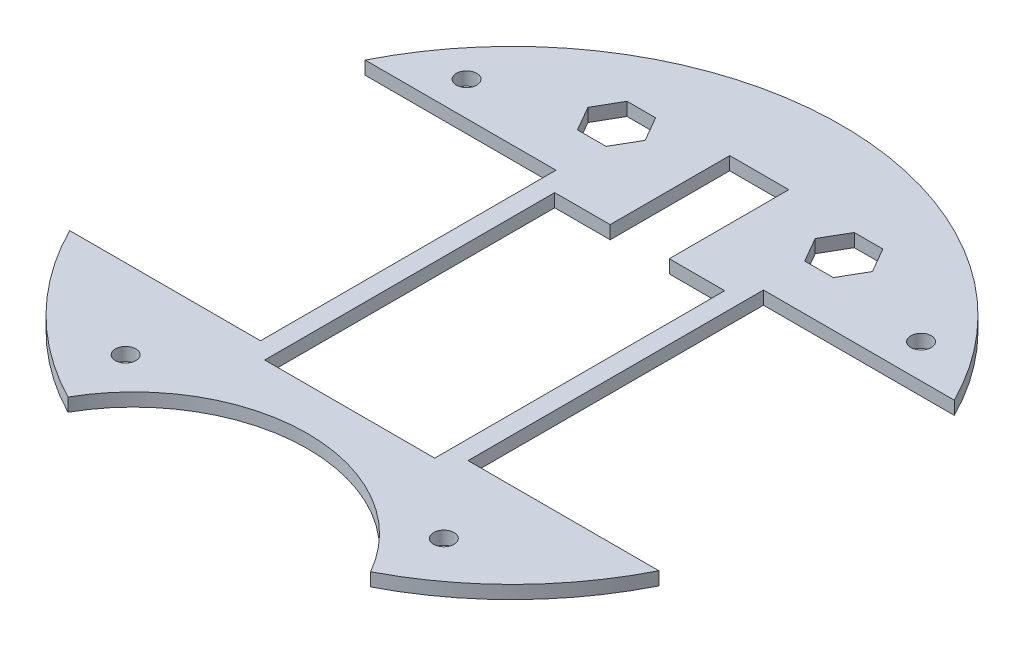
ISO-10303-21;
HEADER;
FILE_DESCRIPTION(('STEP AP214'),'2;1');
FILE_NAME('part.step','',(''),(''),'','','');
FILE_SCHEMA(('AUTOMOTIVE_DESIGN { 1 0 10303 214 1 1 1 1 }'));
ENDSEC;
DATA;
#1=APPLICATION_CONTEXT('core data for automotive mechanical design processes');
#2=APPLICATION_PROTOCOL_DEFINITION('international standard','automotive_design',2000,#1);
#3=PRODUCT_CONTEXT('',#1,'mechanical');
#4=PRODUCT('Part','Part','',(#3));
#5=PRODUCT_RELATED_PRODUCT_CATEGORY('part','',(#4));
#6=PRODUCT_DEFINITION_FORMATION('','',#4);
#7=PRODUCT_DEFINITION_CONTEXT('part definition',#1,'design');
#8=PRODUCT_DEFINITION('design','',#6,#7);
#9=PRODUCT_DEFINITION_SHAPE('','',#8);
#10=(LENGTH_UNIT() NAMED_UNIT(*) SI_UNIT(.MILLI.,.METRE.));
#11=(NAMED_UNIT(*) PLANE_ANGLE_UNIT() SI_UNIT($,.RADIAN.));
#12=(NAMED_UNIT(*) SI_UNIT($,.STERADIAN.) SOLID_ANGLE_UNIT());
#13=UNCERTAINTY_MEASURE_WITH_UNIT(LENGTH_MEASURE(1.E-05),#10,'distance_accuracy_value','');
#14=(GEOMETRIC_REPRESENTATION_CONTEXT(3) GLOBAL_UNCERTAINTY_ASSIGNED_CONTEXT((#13)) GLOBAL_UNIT_ASSIGNED_CONTEXT((#10,
#11,#12)) REPRESENTATION_CONTEXT('',''));
#15=CARTESIAN_POINT('',(0.,0.,0.));
#16=DIRECTION('',(0.,0.,1.));
#17=DIRECTION('',(1.,0.,0.));
#18=AXIS2_PLACEMENT_3D('',#15,#16,#17);
#19=CARTESIAN_POINT('',(18.7,0.,-28.1));
#20=DIRECTION('',(0.,0.,-1.));
#21=DIRECTION('',(-1.,0.,0.));
#22=AXIS2_PLACEMENT_3D('',#19,#20,#21);
#23=PLANE('',#22);
#24=DIRECTION('',(-1.,0.,0.));
#25=VECTOR('',#24,1.);
#26=CARTESIAN_POINT('',(18.7,0.,-28.1));
#27=LINE('',#26,#25);
#28=CARTESIAN_POINT('',(-6.5,0.,-28.1));
#29=VERTEX_POINT('',#28);
#30=CARTESIAN_POINT('',(-18.7,0.,-28.1));
#31=VERTEX_POINT('',#30);
#32=EDGE_CURVE('E424',#29,#31,#27,.T.);
#33=ORIENTED_EDGE('',*,*,#32,.F.);
#34=DIRECTION('',(0.,1.,0.));
#35=VECTOR('',#34,1.);
#36=CARTESIAN_POINT('',(-6.5,0.,-28.1));
#37=LINE('',#36,#35);
#38=CARTESIAN_POINT('',(-6.5,2.9,-28.1));
#39=VERTEX_POINT('',#38);
#40=EDGE_CURVE('E345',#29,#39,#37,.T.);
#41=ORIENTED_EDGE('',*,*,#40,.T.);
#42=DIRECTION('',(-1.,0.,0.));
#43=VECTOR('',#42,1.);
#44=CARTESIAN_POINT('',(18.7,2.9,-28.1));
#45=LINE('',#44,#43);
#46=CARTESIAN_POINT('',(-18.7,2.9,-28.1));
#47=VERTEX_POINT('',#46);
#48=EDGE_CURVE('E436',#39,#47,#45,.T.);
#49=ORIENTED_EDGE('',*,*,#48,.T.);
#50=DIRECTION('',(0.,1.,0.));
#51=VECTOR('',#50,1.);
#52=CARTESIAN_POINT('',(-18.7,0.,-28.1));
#53=LINE('',#52,#51);
#54=EDGE_CURVE('E439',#31,#47,#53,.T.);
#55=ORIENTED_EDGE('',*,*,#54,.F.);
#56=EDGE_LOOP('',(#33,#41,#49,#55));
#57=FACE_BOUND('',#56,.T.);
#58=ADVANCED_FACE('F33',(#57),#23,.F.);
#59=CARTESIAN_POINT('',(0.,2.9,0.));
#60=DIRECTION('',(0.,-1.,0.));
#61=DIRECTION('',(0.,0.,-1.));
#62=AXIS2_PLACEMENT_3D('',#59,#60,#61);
#63=CYLINDRICAL_SURFACE('',#62,72.5);
#64=CARTESIAN_POINT('',(0.,0.,0.));
#65=DIRECTION('',(0.,1.,0.));
#66=DIRECTION('',(0.,0.,1.));
#67=AXIS2_PLACEMENT_3D('',#64,#65,#66);
#68=CIRCLE('',#67,72.5);
#69=CARTESIAN_POINT('',(33.2911053697012,0.,64.4045984636458));
#70=VERTEX_POINT('',#69);
#71=CARTESIAN_POINT('',(64.8074069840786,0.,32.4999999999999));
#72=VERTEX_POINT('',#71);
#73=EDGE_CURVE('E453',#70,#72,#68,.T.);
#74=ORIENTED_EDGE('',*,*,#73,.T.);
#75=DIRECTION('',(0.,1.,0.));
#76=VECTOR('',#75,1.);
#77=CARTESIAN_POINT('',(64.8074069840786,0.,32.4999999999999));
#78=LINE('',#77,#76);
#79=CARTESIAN_POINT('',(64.8074069840786,2.9,32.4999999999999));
#80=VERTEX_POINT('',#79);
#81=EDGE_CURVE('E378',#72,#80,#78,.T.);
#82=ORIENTED_EDGE('',*,*,#81,.T.);
#83=CARTESIAN_POINT('',(0.,2.9,0.));
#84=DIRECTION('',(0.,1.,0.));
#85=DIRECTION('',(0.,0.,1.));
#86=AXIS2_PLACEMENT_3D('',#83,#84,#85);
#87=CIRCLE('',#86,72.5);
#88=CARTESIAN_POINT('',(33.2911053697012,2.9,64.4045984636458));
#89=VERTEX_POINT('',#88);
#90=EDGE_CURVE('E454',#89,#80,#87,.T.);
#91=ORIENTED_EDGE('',*,*,#90,.F.);
#92=DIRECTION('',(0.,-1.,0.));
#93=VECTOR('',#92,1.);
#94=CARTESIAN_POINT('',(33.2911053697012,2.9,64.4045984636458));
#95=LINE('',#94,#93);
#96=EDGE_CURVE('E11',#89,#70,#95,.T.);
#97=ORIENTED_EDGE('',*,*,#96,.T.);
#98=EDGE_LOOP('',(#74,#82,#91,#97));
#99=FACE_BOUND('',#98,.T.);
#100=ADVANCED_FACE('F475',(#99),#63,.T.);
#101=CARTESIAN_POINT('',(64.8074069840786,2.9,-32.5));
#102=VERTEX_POINT('',#101);
#103=CARTESIAN_POINT('',(-64.8074069840786,2.9,-32.5));
#104=VERTEX_POINT('',#103);
#105=EDGE_CURVE('E457',#102,#104,#87,.T.);
#106=ORIENTED_EDGE('',*,*,#105,.F.);
#107=DIRECTION('',(0.,1.,0.));
#108=VECTOR('',#107,1.);
#109=CARTESIAN_POINT('',(64.8074069840786,0.,-32.5));
#110=LINE('',#109,#108);
#111=CARTESIAN_POINT('',(64.8074069840786,0.,-32.5));
#112=VERTEX_POINT('',#111);
#113=EDGE_CURVE('E371',#112,#102,#110,.T.);
#114=ORIENTED_EDGE('',*,*,#113,.F.);
#115=CARTESIAN_POINT('',(-64.8074069840786,0.,-32.5));
#116=VERTEX_POINT('',#115);
#117=EDGE_CURVE('E462',#112,#116,#68,.T.);
#118=ORIENTED_EDGE('',*,*,#117,.T.);
#119=DIRECTION('',(0.,1.,0.));
#120=VECTOR('',#119,1.);
#121=CARTESIAN_POINT('',(-64.8074069840786,0.,-32.5));
#122=LINE('',#121,#120);
#123=EDGE_CURVE('E408',#116,#104,#122,.T.);
#124=ORIENTED_EDGE('',*,*,#123,.T.);
#125=EDGE_LOOP('',(#106,#114,#118,#124));
#126=FACE_BOUND('',#125,.T.);
#127=ADVANCED_FACE('F492',(#126),#63,.T.);
#128=CARTESIAN_POINT('',(0.,2.9,83.2397996376034));
#129=DIRECTION('',(0.,-1.,0.));
#130=DIRECTION('',(0.,0.,-1.));
#131=AXIS2_PLACEMENT_3D('',#128,#129,#130);
#132=CYLINDRICAL_SURFACE('',#131,38.25);
#133=CARTESIAN_POINT('',(0.,0.,83.2397996376034));
#134=DIRECTION('',(0.,-1.,0.));
#135=DIRECTION('',(0.,0.,1.));
#136=AXIS2_PLACEMENT_3D('',#133,#134,#135);
#137=CIRCLE('',#136,38.25);
#138=CARTESIAN_POINT('',(-33.2911053697012,0.,64.4045984636458));
#139=VERTEX_POINT('',#138);
#140=EDGE_CURVE('E442',#139,#70,#137,.T.);
#141=ORIENTED_EDGE('',*,*,#140,.T.);
#142=ORIENTED_EDGE('',*,*,#96,.F.);
#143=CARTESIAN_POINT('',(0.,2.9,83.2397996376034));
#144=DIRECTION('',(0.,-1.,0.));
#145=DIRECTION('',(0.,0.,1.));
#146=AXIS2_PLACEMENT_3D('',#143,#144,#145);
#147=CIRCLE('',#146,38.25);
#148=CARTESIAN_POINT('',(-33.2911053697012,2.9,64.4045984636458));
#149=VERTEX_POINT('',#148);
#150=EDGE_CURVE('E449',#149,#89,#147,.T.);
#151=ORIENTED_EDGE('',*,*,#150,.F.);
#152=DIRECTION('',(0.,-1.,0.));
#153=VECTOR('',#152,1.);
#154=CARTESIAN_POINT('',(-33.2911053697012,2.9,64.4045984636458));
#155=LINE('',#154,#153);
#156=EDGE_CURVE('E41',#149,#139,#155,.T.);
#157=ORIENTED_EDGE('',*,*,#156,.T.);
#158=EDGE_LOOP('',(#141,#142,#151,#157));
#159=FACE_BOUND('',#158,.T.);
#160=ADVANCED_FACE('F35',(#159),#132,.F.);
#161=CARTESIAN_POINT('',(-64.8074069840787,2.9,32.4999999999999));
#162=VERTEX_POINT('',#161);
#163=EDGE_CURVE('E452',#162,#149,#87,.T.);
#164=ORIENTED_EDGE('',*,*,#163,.F.);
#165=DIRECTION('',(0.,1.,0.));
#166=VECTOR('',#165,1.);
#167=CARTESIAN_POINT('',(-64.8074069840787,0.,32.4999999999999));
#168=LINE('',#167,#166);
#169=CARTESIAN_POINT('',(-64.8074069840787,0.,32.4999999999999));
#170=VERTEX_POINT('',#169);
#171=EDGE_CURVE('E405',#170,#162,#168,.T.);
#172=ORIENTED_EDGE('',*,*,#171,.F.);
#173=EDGE_CURVE('E460',#170,#139,#68,.T.);
#174=ORIENTED_EDGE('',*,*,#173,.T.);
#175=ORIENTED_EDGE('',*,*,#156,.F.);
#176=EDGE_LOOP('',(#164,#172,#174,#175));
#177=FACE_BOUND('',#176,.T.);
#178=ADVANCED_FACE('F494',(#177),#63,.T.);
#179=CARTESIAN_POINT('',(0.,2.9,41.6198998188017));
#180=DIRECTION('',(0.,1.,0.));
#181=DIRECTION('',(0.,0.,1.));
#182=AXIS2_PLACEMENT_3D('',#179,#180,#181);
#183=PLANE('',#182);
#184=CARTESIAN_POINT('',(-35.,2.9,50.));
#185=DIRECTION('',(0.,1.,0.));
#186=DIRECTION('',(0.,0.,1.));
#187=AXIS2_PLACEMENT_3D('',#184,#185,#186);
#188=CIRCLE('',#187,2.25);
#189=CARTESIAN_POINT('',(-35.,2.9,52.25));
#190=VERTEX_POINT('',#189);
#191=EDGE_CURVE('E782',#190,#190,#188,.T.);
#192=ORIENTED_EDGE('',*,*,#191,.F.);
#193=EDGE_LOOP('',(#192));
#194=FACE_BOUND('',#193,.T.);
#195=CARTESIAN_POINT('',(-50.,2.9,-40.));
#196=DIRECTION('',(0.,1.,0.));
#197=DIRECTION('',(0.,0.,1.));
#198=AXIS2_PLACEMENT_3D('',#195,#196,#197);
#199=CIRCLE('',#198,2.25);
#200=CARTESIAN_POINT('',(-50.,2.9,-37.75));
#201=VERTEX_POINT('',#200);
#202=EDGE_CURVE('E787',#201,#201,#199,.T.);
#203=ORIENTED_EDGE('',*,*,#202,.F.);
#204=EDGE_LOOP('',(#203));
#205=FACE_BOUND('',#204,.T.);
#206=CARTESIAN_POINT('',(50.,2.9,-40.));
#207=DIRECTION('',(0.,1.,0.));
#208=DIRECTION('',(0.,0.,1.));
#209=AXIS2_PLACEMENT_3D('',#206,#207,#208);
#210=CIRCLE('',#209,2.25);
#211=CARTESIAN_POINT('',(50.,2.9,-37.75));
#212=VERTEX_POINT('',#211);
#213=EDGE_CURVE('E795',#212,#212,#210,.T.);
#214=ORIENTED_EDGE('',*,*,#213,.F.);
#215=EDGE_LOOP('',(#214));
#216=FACE_BOUND('',#215,.T.);
#217=CARTESIAN_POINT('',(35.,2.9,50.));
#218=DIRECTION('',(0.,1.,0.));
#219=DIRECTION('',(0.,0.,1.));
#220=AXIS2_PLACEMENT_3D('',#217,#218,#219);
#221=CIRCLE('',#220,2.25);
#222=CARTESIAN_POINT('',(35.,2.9,52.25));
#223=VERTEX_POINT('',#222);
#224=EDGE_CURVE('E255',#223,#223,#221,.T.);
#225=ORIENTED_EDGE('',*,*,#224,.F.);
#226=EDGE_LOOP('',(#225));
#227=FACE_BOUND('',#226,.T.);
#228=DIRECTION('',(1.,0.,0.));
#229=VECTOR('',#228,1.);
#230=CARTESIAN_POINT('',(21.8534410329166,2.9,-42.55));
#231=LINE('',#230,#229);
#232=CARTESIAN_POINT('',(21.8534410329166,2.9,-42.55));
#233=VERTEX_POINT('',#232);
#234=CARTESIAN_POINT('',(28.1465589670834,2.9,-42.55));
#235=VERTEX_POINT('',#234);
#236=EDGE_CURVE('E48',#233,#235,#231,.T.);
#237=ORIENTED_EDGE('',*,*,#236,.F.);
#238=DIRECTION('',(0.5,0.,0.866025403784439));
#239=VECTOR('',#238,1.);
#240=CARTESIAN_POINT('',(18.7068820658331,2.9,-48.));
#241=LINE('',#240,#239);
#242=CARTESIAN_POINT('',(18.7068820658331,2.9,-48.));
#243=VERTEX_POINT('',#242);
#244=EDGE_CURVE('E249',#243,#233,#241,.T.);
#245=ORIENTED_EDGE('',*,*,#244,.F.);
#246=DIRECTION('',(-0.5,0.,0.866025403784438));
#247=VECTOR('',#246,1.);
#248=CARTESIAN_POINT('',(21.8534410329165,2.9,-53.45));
#249=LINE('',#248,#247);
#250=CARTESIAN_POINT('',(21.8534410329165,2.9,-53.45));
#251=VERTEX_POINT('',#250);
#252=EDGE_CURVE('E252',#251,#243,#249,.T.);
#253=ORIENTED_EDGE('',*,*,#252,.F.);
#254=DIRECTION('',(-1.,0.,0.));
#255=VECTOR('',#254,1.);
#256=CARTESIAN_POINT('',(28.1465589670835,2.9,-53.45));
#257=LINE('',#256,#255);
#258=CARTESIAN_POINT('',(28.1465589670835,2.9,-53.45));
#259=VERTEX_POINT('',#258);
#260=EDGE_CURVE('E272',#259,#251,#257,.T.);
#261=ORIENTED_EDGE('',*,*,#260,.F.);
#262=DIRECTION('',(-0.5,0.,-0.866025403784439));
#263=VECTOR('',#262,1.);
#264=CARTESIAN_POINT('',(31.2931179341669,2.9,-48.));
#265=LINE('',#264,#263);
#266=CARTESIAN_POINT('',(31.2931179341669,2.9,-48.));
#267=VERTEX_POINT('',#266);
#268=EDGE_CURVE('E269',#267,#259,#265,.T.);
#269=ORIENTED_EDGE('',*,*,#268,.F.);
#270=DIRECTION('',(0.499999999999999,0.,-0.866025403784439));
#271=VECTOR('',#270,1.);
#272=CARTESIAN_POINT('',(28.1465589670835,2.9,-42.55));
#273=LINE('',#272,#271);
#274=EDGE_CURVE('E266',#235,#267,#273,.T.);
#275=ORIENTED_EDGE('',*,*,#274,.F.);
#276=EDGE_LOOP('',(#237,#245,#253,#261,#269,#275));
#277=FACE_BOUND('',#276,.T.);
#278=DIRECTION('',(0.5,0.,-0.866025403784439));
#279=VECTOR('',#278,1.);
#280=CARTESIAN_POINT('',(-21.8534410329166,2.9,-42.55));
#281=LINE('',#280,#279);
#282=CARTESIAN_POINT('',(-21.8534410329166,2.9,-42.55));
#283=VERTEX_POINT('',#282);
#284=CARTESIAN_POINT('',(-18.7068820658331,2.9,-48.));
#285=VERTEX_POINT('',#284);
#286=EDGE_CURVE('E279',#283,#285,#281,.T.);
#287=ORIENTED_EDGE('',*,*,#286,.F.);
#288=DIRECTION('',(1.,0.,0.));
#289=VECTOR('',#288,1.);
#290=CARTESIAN_POINT('',(-28.1465589670835,2.9,-42.55));
#291=LINE('',#290,#289);
#292=CARTESIAN_POINT('',(-28.1465589670835,2.9,-42.55));
#293=VERTEX_POINT('',#292);
#294=EDGE_CURVE('E291',#293,#283,#291,.T.);
#295=ORIENTED_EDGE('',*,*,#294,.F.);
#296=DIRECTION('',(0.499999999999999,0.,0.866025403784439));
#297=VECTOR('',#296,1.);
#298=CARTESIAN_POINT('',(-31.2931179341669,2.9,-48.));
#299=LINE('',#298,#297);
#300=CARTESIAN_POINT('',(-31.2931179341669,2.9,-48.));
#301=VERTEX_POINT('',#300);
#302=EDGE_CURVE('E317',#301,#293,#299,.T.);
#303=ORIENTED_EDGE('',*,*,#302,.F.);
#304=DIRECTION('',(-0.5,0.,0.866025403784439));
#305=VECTOR('',#304,1.);
#306=CARTESIAN_POINT('',(-28.1465589670835,2.9,-53.45));
#307=LINE('',#306,#305);
#308=CARTESIAN_POINT('',(-28.1465589670835,2.9,-53.45));
#309=VERTEX_POINT('',#308);
#310=EDGE_CURVE('E314',#309,#301,#307,.T.);
#311=ORIENTED_EDGE('',*,*,#310,.F.);
#312=DIRECTION('',(-1.,0.,0.));
#313=VECTOR('',#312,1.);
#314=CARTESIAN_POINT('',(-21.8534410329165,2.9,-53.45));
#315=LINE('',#314,#313);
#316=CARTESIAN_POINT('',(-21.8534410329165,2.9,-53.45));
#317=VERTEX_POINT('',#316);
#318=EDGE_CURVE('E311',#317,#309,#315,.T.);
#319=ORIENTED_EDGE('',*,*,#318,.F.);
#320=DIRECTION('',(-0.5,0.,-0.866025403784438));
#321=VECTOR('',#320,1.);
#322=CARTESIAN_POINT('',(-18.7068820658331,2.9,-48.));
#323=LINE('',#322,#321);
#324=EDGE_CURVE('E308',#285,#317,#323,.T.);
#325=ORIENTED_EDGE('',*,*,#324,.F.);
#326=EDGE_LOOP('',(#287,#295,#303,#311,#319,#325));
#327=FACE_BOUND('',#326,.T.);
#328=DIRECTION('',(0.,0.,1.));
#329=VECTOR('',#328,1.);
#330=CARTESIAN_POINT('',(-6.5,2.9,-28.1));
#331=LINE('',#330,#329);
#332=CARTESIAN_POINT('',(-6.5,2.9,-54.4));
#333=VERTEX_POINT('',#332);
#334=EDGE_CURVE('E324',#333,#39,#331,.T.);
#335=ORIENTED_EDGE('',*,*,#334,.F.);
#336=DIRECTION('',(-1.,0.,0.));
#337=VECTOR('',#336,1.);
#338=CARTESIAN_POINT('',(6.5,2.9,-54.4));
#339=LINE('',#338,#337);
#340=CARTESIAN_POINT('',(6.5,2.9,-54.4));
#341=VERTEX_POINT('',#340);
#342=EDGE_CURVE('E339',#341,#333,#339,.T.);
#343=ORIENTED_EDGE('',*,*,#342,.F.);
#344=DIRECTION('',(0.,0.,-1.));
#345=VECTOR('',#344,1.);
#346=CARTESIAN_POINT('',(6.5,2.9,-28.1));
#347=LINE('',#346,#345);
#348=CARTESIAN_POINT('',(6.5,2.9,-28.1));
#349=VERTEX_POINT('',#348);
#350=EDGE_CURVE('E347',#349,#341,#347,.T.);
#351=ORIENTED_EDGE('',*,*,#350,.F.);
#352=CARTESIAN_POINT('',(18.7,2.9,-28.1));
#353=VERTEX_POINT('',#352);
#354=EDGE_CURVE('E418',#353,#349,#45,.T.);
#355=ORIENTED_EDGE('',*,*,#354,.F.);
#356=DIRECTION('',(0.,0.,-1.));
#357=VECTOR('',#356,1.);
#358=CARTESIAN_POINT('',(18.7,2.9,35.7));
#359=LINE('',#358,#357);
#360=CARTESIAN_POINT('',(18.7,2.9,35.7));
#361=VERTEX_POINT('',#360);
#362=EDGE_CURVE('E433',#361,#353,#359,.T.);
#363=ORIENTED_EDGE('',*,*,#362,.F.);
#364=DIRECTION('',(1.,0.,0.));
#365=VECTOR('',#364,1.);
#366=CARTESIAN_POINT('',(-18.7,2.9,35.7));
#367=LINE('',#366,#365);
#368=CARTESIAN_POINT('',(-18.7,2.9,35.7));
#369=VERTEX_POINT('',#368);
#370=EDGE_CURVE('E430',#369,#361,#367,.T.);
#371=ORIENTED_EDGE('',*,*,#370,.F.);
#372=DIRECTION('',(0.,0.,1.));
#373=VECTOR('',#372,1.);
#374=CARTESIAN_POINT('',(-18.7,2.9,-28.1));
#375=LINE('',#374,#373);
#376=EDGE_CURVE('E407',#47,#369,#375,.T.);
#377=ORIENTED_EDGE('',*,*,#376,.F.);
#378=ORIENTED_EDGE('',*,*,#48,.F.);
#379=EDGE_LOOP('',(#335,#343,#351,#355,#363,#371,#377,#378));
#380=FACE_BOUND('',#379,.T.);
#381=DIRECTION('',(1.,0.,0.));
#382=VECTOR('',#381,1.);
#383=CARTESIAN_POINT('',(34.6299999999999,2.9,32.5));
#384=LINE('',#383,#382);
#385=CARTESIAN_POINT('',(22.8299999999999,2.9,32.4999999999999));
#386=VERTEX_POINT('',#385);
#387=EDGE_CURVE('E365',#386,#80,#384,.T.);
#388=ORIENTED_EDGE('',*,*,#387,.F.);
#389=DIRECTION('',(0.,0.,1.));
#390=VECTOR('',#389,1.);
#391=CARTESIAN_POINT('',(22.8299999999999,2.9,-32.5));
#392=LINE('',#391,#390);
#393=CARTESIAN_POINT('',(22.8299999999999,2.9,-32.5));
#394=VERTEX_POINT('',#393);
#395=EDGE_CURVE('E374',#394,#386,#392,.T.);
#396=ORIENTED_EDGE('',*,*,#395,.F.);
#397=DIRECTION('',(-1.,0.,0.));
#398=VECTOR('',#397,1.);
#399=CARTESIAN_POINT('',(64.8074069840786,2.9,-32.5));
#400=LINE('',#399,#398);
#401=EDGE_CURVE('E354',#102,#394,#400,.T.);
#402=ORIENTED_EDGE('',*,*,#401,.F.);
#403=ORIENTED_EDGE('',*,*,#105,.T.);
#404=DIRECTION('',(-1.,0.,0.));
#405=VECTOR('',#404,1.);
#406=CARTESIAN_POINT('',(-22.8299999999999,2.9,-32.5));
#407=LINE('',#406,#405);
#408=CARTESIAN_POINT('',(-22.8299999999999,2.9,-32.5));
#409=VERTEX_POINT('',#408);
#410=EDGE_CURVE('E391',#409,#104,#407,.T.);
#411=ORIENTED_EDGE('',*,*,#410,.F.);
#412=DIRECTION('',(0.,0.,-1.));
#413=VECTOR('',#412,1.);
#414=CARTESIAN_POINT('',(-22.8299999999999,2.9,32.4999999999999));
#415=LINE('',#414,#413);
#416=CARTESIAN_POINT('',(-22.8299999999999,2.9,32.4999999999999));
#417=VERTEX_POINT('',#416);
#418=EDGE_CURVE('E400',#417,#409,#415,.T.);
#419=ORIENTED_EDGE('',*,*,#418,.F.);
#420=DIRECTION('',(1.,0.,0.));
#421=VECTOR('',#420,1.);
#422=CARTESIAN_POINT('',(-34.6299999999999,2.9,32.5));
#423=LINE('',#422,#421);
#424=EDGE_CURVE('E381',#162,#417,#423,.T.);
#425=ORIENTED_EDGE('',*,*,#424,.F.);
#426=ORIENTED_EDGE('',*,*,#163,.T.);
#427=ORIENTED_EDGE('',*,*,#150,.T.);
#428=ORIENTED_EDGE('',*,*,#90,.T.);
#429=EDGE_LOOP('',(#388,#396,#402,#403,#411,#419,#425,#426,#427,#428));
#430=FACE_BOUND('',#429,.T.);
#431=ADVANCED_FACE('F478',(#194,#205,#216,#227,#277,#327,#380,#430),#183,.T.);
#432=CARTESIAN_POINT('',(0.,0.,41.6198998188017));
#433=DIRECTION('',(0.,1.,0.));
#434=DIRECTION('',(0.,0.,1.));
#435=AXIS2_PLACEMENT_3D('',#432,#433,#434);
#436=PLANE('',#435);
#437=CARTESIAN_POINT('',(-35.,0.,50.));
#438=DIRECTION('',(0.,1.,0.));
#439=DIRECTION('',(0.,0.,1.));
#440=AXIS2_PLACEMENT_3D('',#437,#438,#439);
#441=CIRCLE('',#440,2.25);
#442=CARTESIAN_POINT('',(-35.,0.,52.25));
#443=VERTEX_POINT('',#442);
#444=EDGE_CURVE('E779',#443,#443,#441,.T.);
#445=ORIENTED_EDGE('',*,*,#444,.T.);
#446=EDGE_LOOP('',(#445));
#447=FACE_BOUND('',#446,.T.);
#448=CARTESIAN_POINT('',(-50.,0.,-40.));
#449=DIRECTION('',(0.,1.,0.));
#450=DIRECTION('',(0.,0.,1.));
#451=AXIS2_PLACEMENT_3D('',#448,#449,#450);
#452=CIRCLE('',#451,2.25);
#453=CARTESIAN_POINT('',(-50.,0.,-37.75));
#454=VERTEX_POINT('',#453);
#455=EDGE_CURVE('E783',#454,#454,#452,.T.);
#456=ORIENTED_EDGE('',*,*,#455,.T.);
#457=EDGE_LOOP('',(#456));
#458=FACE_BOUND('',#457,.T.);
#459=CARTESIAN_POINT('',(50.,0.,-40.));
#460=DIRECTION('',(0.,1.,0.));
#461=DIRECTION('',(0.,0.,1.));
#462=AXIS2_PLACEMENT_3D('',#459,#460,#461);
#463=CIRCLE('',#462,2.25);
#464=CARTESIAN_POINT('',(50.,0.,-37.75));
#465=VERTEX_POINT('',#464);
#466=EDGE_CURVE('E792',#465,#465,#463,.T.);
#467=ORIENTED_EDGE('',*,*,#466,.T.);
#468=EDGE_LOOP('',(#467));
#469=FACE_BOUND('',#468,.T.);
#470=CARTESIAN_POINT('',(35.,0.,50.));
#471=DIRECTION('',(0.,1.,0.));
#472=DIRECTION('',(0.,0.,1.));
#473=AXIS2_PLACEMENT_3D('',#470,#471,#472);
#474=CIRCLE('',#473,2.25);
#475=CARTESIAN_POINT('',(35.,0.,52.25));
#476=VERTEX_POINT('',#475);
#477=EDGE_CURVE('E267',#476,#476,#474,.T.);
#478=ORIENTED_EDGE('',*,*,#477,.T.);
#479=EDGE_LOOP('',(#478));
#480=FACE_BOUND('',#479,.T.);
#481=DIRECTION('',(0.5,0.,0.866025403784439));
#482=VECTOR('',#481,1.);
#483=CARTESIAN_POINT('',(18.7068820658331,0.,-48.));
#484=LINE('',#483,#482);
#485=CARTESIAN_POINT('',(18.7068820658331,0.,-48.));
#486=VERTEX_POINT('',#485);
#487=CARTESIAN_POINT('',(21.8534410329166,0.,-42.55));
#488=VERTEX_POINT('',#487);
#489=EDGE_CURVE('E238',#486,#488,#484,.T.);
#490=ORIENTED_EDGE('',*,*,#489,.T.);
#491=DIRECTION('',(1.,0.,0.));
#492=VECTOR('',#491,1.);
#493=CARTESIAN_POINT('',(21.8534410329166,0.,-42.55));
#494=LINE('',#493,#492);
#495=CARTESIAN_POINT('',(28.1465589670835,0.,-42.55));
#496=VERTEX_POINT('',#495);
#497=EDGE_CURVE('E232',#488,#496,#494,.T.);
#498=ORIENTED_EDGE('',*,*,#497,.T.);
#499=DIRECTION('',(0.499999999999999,0.,-0.866025403784439));
#500=VECTOR('',#499,1.);
#501=CARTESIAN_POINT('',(28.1465589670835,0.,-42.55));
#502=LINE('',#501,#500);
#503=CARTESIAN_POINT('',(31.2931179341669,0.,-48.));
#504=VERTEX_POINT('',#503);
#505=EDGE_CURVE('E241',#496,#504,#502,.T.);
#506=ORIENTED_EDGE('',*,*,#505,.T.);
#507=DIRECTION('',(-0.5,0.,-0.866025403784439));
#508=VECTOR('',#507,1.);
#509=CARTESIAN_POINT('',(31.2931179341669,0.,-48.));
#510=LINE('',#509,#508);
#511=CARTESIAN_POINT('',(28.1465589670835,0.,-53.45));
#512=VERTEX_POINT('',#511);
#513=EDGE_CURVE('E56',#504,#512,#510,.T.);
#514=ORIENTED_EDGE('',*,*,#513,.T.);
#515=DIRECTION('',(-1.,0.,0.));
#516=VECTOR('',#515,1.);
#517=CARTESIAN_POINT('',(28.1465589670835,0.,-53.45));
#518=LINE('',#517,#516);
#519=CARTESIAN_POINT('',(21.8534410329165,0.,-53.45));
#520=VERTEX_POINT('',#519);
#521=EDGE_CURVE('E259',#512,#520,#518,.T.);
#522=ORIENTED_EDGE('',*,*,#521,.T.);
#523=DIRECTION('',(-0.5,0.,0.866025403784438));
#524=VECTOR('',#523,1.);
#525=CARTESIAN_POINT('',(21.8534410329165,0.,-53.45));
#526=LINE('',#525,#524);
#527=EDGE_CURVE('E262',#520,#486,#526,.T.);
#528=ORIENTED_EDGE('',*,*,#527,.T.);
#529=EDGE_LOOP('',(#490,#498,#506,#514,#522,#528));
#530=FACE_BOUND('',#529,.T.);
#531=DIRECTION('',(1.,0.,0.));
#532=VECTOR('',#531,1.);
#533=CARTESIAN_POINT('',(-28.1465589670835,0.,-42.55));
#534=LINE('',#533,#532);
#535=CARTESIAN_POINT('',(-28.1465589670835,0.,-42.55));
#536=VERTEX_POINT('',#535);
#537=CARTESIAN_POINT('',(-21.8534410329166,0.,-42.55));
#538=VERTEX_POINT('',#537);
#539=EDGE_CURVE('E303',#536,#538,#534,.T.);
#540=ORIENTED_EDGE('',*,*,#539,.T.);
#541=DIRECTION('',(0.5,0.,-0.866025403784439));
#542=VECTOR('',#541,1.);
#543=CARTESIAN_POINT('',(-21.8534410329166,0.,-42.55));
#544=LINE('',#543,#542);
#545=CARTESIAN_POINT('',(-18.7068820658331,0.,-48.));
#546=VERTEX_POINT('',#545);
#547=EDGE_CURVE('E287',#538,#546,#544,.T.);
#548=ORIENTED_EDGE('',*,*,#547,.T.);
#549=DIRECTION('',(-0.5,0.,-0.866025403784438));
#550=VECTOR('',#549,1.);
#551=CARTESIAN_POINT('',(-18.7068820658331,0.,-48.));
#552=LINE('',#551,#550);
#553=CARTESIAN_POINT('',(-21.8534410329166,0.,-53.45));
#554=VERTEX_POINT('',#553);
#555=EDGE_CURVE('E290',#546,#554,#552,.T.);
#556=ORIENTED_EDGE('',*,*,#555,.T.);
#557=DIRECTION('',(-1.,0.,0.));
#558=VECTOR('',#557,1.);
#559=CARTESIAN_POINT('',(-21.8534410329165,0.,-53.45));
#560=LINE('',#559,#558);
#561=CARTESIAN_POINT('',(-28.1465589670835,0.,-53.45));
#562=VERTEX_POINT('',#561);
#563=EDGE_CURVE('E294',#554,#562,#560,.T.);
#564=ORIENTED_EDGE('',*,*,#563,.T.);
#565=DIRECTION('',(-0.5,0.,0.866025403784439));
#566=VECTOR('',#565,1.);
#567=CARTESIAN_POINT('',(-28.1465589670835,0.,-53.45));
#568=LINE('',#567,#566);
#569=CARTESIAN_POINT('',(-31.2931179341669,0.,-48.));
#570=VERTEX_POINT('',#569);
#571=EDGE_CURVE('E297',#562,#570,#568,.T.);
#572=ORIENTED_EDGE('',*,*,#571,.T.);
#573=DIRECTION('',(0.499999999999999,0.,0.866025403784439));
#574=VECTOR('',#573,1.);
#575=CARTESIAN_POINT('',(-31.2931179341669,0.,-48.));
#576=LINE('',#575,#574);
#577=EDGE_CURVE('E300',#570,#536,#576,.T.);
#578=ORIENTED_EDGE('',*,*,#577,.T.);
#579=EDGE_LOOP('',(#540,#548,#556,#564,#572,#578));
#580=FACE_BOUND('',#579,.T.);
#581=DIRECTION('',(-1.,0.,0.));
#582=VECTOR('',#581,1.);
#583=CARTESIAN_POINT('',(6.5,0.,-54.4));
#584=LINE('',#583,#582);
#585=CARTESIAN_POINT('',(6.5,0.,-54.4));
#586=VERTEX_POINT('',#585);
#587=CARTESIAN_POINT('',(-6.5,0.,-54.4));
#588=VERTEX_POINT('',#587);
#589=EDGE_CURVE('E342',#586,#588,#584,.T.);
#590=ORIENTED_EDGE('',*,*,#589,.T.);
#591=DIRECTION('',(0.,0.,1.));
#592=VECTOR('',#591,1.);
#593=CARTESIAN_POINT('',(-6.5,0.,-28.1));
#594=LINE('',#593,#592);
#595=EDGE_CURVE('E335',#588,#29,#594,.T.);
#596=ORIENTED_EDGE('',*,*,#595,.T.);
#597=ORIENTED_EDGE('',*,*,#32,.T.);
#598=DIRECTION('',(0.,0.,1.));
#599=VECTOR('',#598,1.);
#600=CARTESIAN_POINT('',(-18.7,0.,-28.1));
#601=LINE('',#600,#599);
#602=CARTESIAN_POINT('',(-18.7,0.,35.7));
#603=VERTEX_POINT('',#602);
#604=EDGE_CURVE('E414',#31,#603,#601,.T.);
#605=ORIENTED_EDGE('',*,*,#604,.T.);
#606=DIRECTION('',(1.,0.,0.));
#607=VECTOR('',#606,1.);
#608=CARTESIAN_POINT('',(-18.7,0.,35.7));
#609=LINE('',#608,#607);
#610=CARTESIAN_POINT('',(18.7,0.,35.7));
#611=VERTEX_POINT('',#610);
#612=EDGE_CURVE('E417',#603,#611,#609,.T.);
#613=ORIENTED_EDGE('',*,*,#612,.T.);
#614=DIRECTION('',(0.,0.,-1.));
#615=VECTOR('',#614,1.);
#616=CARTESIAN_POINT('',(18.7,0.,35.7));
#617=LINE('',#616,#615);
#618=CARTESIAN_POINT('',(18.7,0.,-28.1));
#619=VERTEX_POINT('',#618);
#620=EDGE_CURVE('E421',#611,#619,#617,.T.);
#621=ORIENTED_EDGE('',*,*,#620,.T.);
#622=CARTESIAN_POINT('',(6.5,0.,-28.1));
#623=VERTEX_POINT('',#622);
#624=EDGE_CURVE('E425',#619,#623,#27,.T.);
#625=ORIENTED_EDGE('',*,*,#624,.T.);
#626=DIRECTION('',(0.,0.,-1.));
#627=VECTOR('',#626,1.);
#628=CARTESIAN_POINT('',(6.5,0.,-28.1));
#629=LINE('',#628,#627);
#630=EDGE_CURVE('E338',#623,#586,#629,.T.);
#631=ORIENTED_EDGE('',*,*,#630,.T.);
#632=EDGE_LOOP('',(#590,#596,#597,#605,#613,#621,#625,#631));
#633=FACE_BOUND('',#632,.T.);
#634=DIRECTION('',(0.,0.,1.));
#635=VECTOR('',#634,1.);
#636=CARTESIAN_POINT('',(22.8299999999999,0.,-32.5));
#637=LINE('',#636,#635);
#638=CARTESIAN_POINT('',(22.8299999999999,0.,-32.5));
#639=VERTEX_POINT('',#638);
#640=CARTESIAN_POINT('',(22.8299999999999,0.,32.4999999999999));
#641=VERTEX_POINT('',#640);
#642=EDGE_CURVE('E364',#639,#641,#637,.T.);
#643=ORIENTED_EDGE('',*,*,#642,.T.);
#644=DIRECTION('',(1.,0.,0.));
#645=VECTOR('',#644,1.);
#646=CARTESIAN_POINT('',(22.8299999999999,0.,32.4999999999999));
#647=LINE('',#646,#645);
#648=EDGE_CURVE('E368',#641,#72,#647,.T.);
#649=ORIENTED_EDGE('',*,*,#648,.T.);
#650=ORIENTED_EDGE('',*,*,#73,.F.);
#651=ORIENTED_EDGE('',*,*,#140,.F.);
#652=ORIENTED_EDGE('',*,*,#173,.F.);
#653=DIRECTION('',(1.,0.,0.));
#654=VECTOR('',#653,1.);
#655=CARTESIAN_POINT('',(-64.8074069840786,0.,32.4999999999999));
#656=LINE('',#655,#654);
#657=CARTESIAN_POINT('',(-22.8299999999999,0.,32.4999999999999));
#658=VERTEX_POINT('',#657);
#659=EDGE_CURVE('E387',#170,#658,#656,.T.);
#660=ORIENTED_EDGE('',*,*,#659,.T.);
#661=DIRECTION('',(0.,0.,-1.));
#662=VECTOR('',#661,1.);
#663=CARTESIAN_POINT('',(-22.8299999999999,0.,32.4999999999999));
#664=LINE('',#663,#662);
#665=CARTESIAN_POINT('',(-22.8299999999999,0.,-32.5));
#666=VERTEX_POINT('',#665);
#667=EDGE_CURVE('E390',#658,#666,#664,.T.);
#668=ORIENTED_EDGE('',*,*,#667,.T.);
#669=DIRECTION('',(-1.,0.,0.));
#670=VECTOR('',#669,1.);
#671=CARTESIAN_POINT('',(-22.8299999999999,0.,-32.5));
#672=LINE('',#671,#670);
#673=EDGE_CURVE('E394',#666,#116,#672,.T.);
#674=ORIENTED_EDGE('',*,*,#673,.T.);
#675=ORIENTED_EDGE('',*,*,#117,.F.);
#676=DIRECTION('',(-1.,0.,0.));
#677=VECTOR('',#676,1.);
#678=CARTESIAN_POINT('',(64.8074069840786,0.,-32.5));
#679=LINE('',#678,#677);
#680=EDGE_CURVE('E361',#112,#639,#679,.T.);
#681=ORIENTED_EDGE('',*,*,#680,.T.);
#682=EDGE_LOOP('',(#643,#649,#650,#651,#652,#660,#668,#674,#675,#681));
#683=FACE_BOUND('',#682,.T.);
#684=ADVANCED_FACE('F245',(#447,#458,#469,#480,#530,#580,#633,#683),#436,.F.);
#685=CARTESIAN_POINT('',(-18.7,0.,-28.1));
#686=DIRECTION('',(-1.,0.,0.));
#687=DIRECTION('',(0.,0.,1.));
#688=AXIS2_PLACEMENT_3D('',#685,#686,#687);
#689=PLANE('',#688);
#690=ORIENTED_EDGE('',*,*,#376,.T.);
#691=DIRECTION('',(0.,1.,0.));
#692=VECTOR('',#691,1.);
#693=CARTESIAN_POINT('',(-18.7,0.,35.7));
#694=LINE('',#693,#692);
#695=EDGE_CURVE('E428',#603,#369,#694,.T.);
#696=ORIENTED_EDGE('',*,*,#695,.F.);
#697=ORIENTED_EDGE('',*,*,#604,.F.);
#698=ORIENTED_EDGE('',*,*,#54,.T.);
#699=EDGE_LOOP('',(#690,#696,#697,#698));
#700=FACE_BOUND('',#699,.T.);
#701=ADVANCED_FACE('F521',(#700),#689,.F.);
#702=ORIENTED_EDGE('',*,*,#354,.T.);
#703=DIRECTION('',(0.,1.,0.));
#704=VECTOR('',#703,1.);
#705=CARTESIAN_POINT('',(6.5,0.,-28.1));
#706=LINE('',#705,#704);
#707=EDGE_CURVE('E357',#623,#349,#706,.T.);
#708=ORIENTED_EDGE('',*,*,#707,.F.);
#709=ORIENTED_EDGE('',*,*,#624,.F.);
#710=DIRECTION('',(0.,1.,0.));
#711=VECTOR('',#710,1.);
#712=CARTESIAN_POINT('',(18.7,0.,-28.1));
#713=LINE('',#712,#711);
#714=EDGE_CURVE('E443',#619,#353,#713,.T.);
#715=ORIENTED_EDGE('',*,*,#714,.T.);
#716=EDGE_LOOP('',(#702,#708,#709,#715));
#717=FACE_BOUND('',#716,.T.);
#718=ADVANCED_FACE('F513',(#717),#23,.F.);
#719=CARTESIAN_POINT('',(18.7,0.,35.7));
#720=DIRECTION('',(1.,0.,0.));
#721=DIRECTION('',(0.,0.,-1.));
#722=AXIS2_PLACEMENT_3D('',#719,#720,#721);
#723=PLANE('',#722);
#724=ORIENTED_EDGE('',*,*,#362,.T.);
#725=ORIENTED_EDGE('',*,*,#714,.F.);
#726=ORIENTED_EDGE('',*,*,#620,.F.);
#727=DIRECTION('',(0.,1.,0.));
#728=VECTOR('',#727,1.);
#729=CARTESIAN_POINT('',(18.7,0.,35.7));
#730=LINE('',#729,#728);
#731=EDGE_CURVE('E445',#611,#361,#730,.T.);
#732=ORIENTED_EDGE('',*,*,#731,.T.);
#733=EDGE_LOOP('',(#724,#725,#726,#732));
#734=FACE_BOUND('',#733,.T.);
#735=ADVANCED_FACE('F520',(#734),#723,.F.);
#736=CARTESIAN_POINT('',(-18.7,0.,35.7));
#737=DIRECTION('',(0.,0.,1.));
#738=DIRECTION('',(1.,0.,0.));
#739=AXIS2_PLACEMENT_3D('',#736,#737,#738);
#740=PLANE('',#739);
#741=ORIENTED_EDGE('',*,*,#370,.T.);
#742=ORIENTED_EDGE('',*,*,#731,.F.);
#743=ORIENTED_EDGE('',*,*,#612,.F.);
#744=ORIENTED_EDGE('',*,*,#695,.T.);
#745=EDGE_LOOP('',(#741,#742,#743,#744));
#746=FACE_BOUND('',#745,.T.);
#747=ADVANCED_FACE('F508',(#746),#740,.F.);
#748=CARTESIAN_POINT('',(-22.8299999999999,0.,-32.5));
#749=DIRECTION('',(0.,0.,-1.));
#750=DIRECTION('',(-1.,0.,0.));
#751=AXIS2_PLACEMENT_3D('',#748,#749,#750);
#752=PLANE('',#751);
#753=ORIENTED_EDGE('',*,*,#410,.T.);
#754=ORIENTED_EDGE('',*,*,#123,.F.);
#755=ORIENTED_EDGE('',*,*,#673,.F.);
#756=DIRECTION('',(0.,1.,0.));
#757=VECTOR('',#756,1.);
#758=CARTESIAN_POINT('',(-22.8299999999999,0.,-32.5));
#759=LINE('',#758,#757);
#760=EDGE_CURVE('E411',#666,#409,#759,.T.);
#761=ORIENTED_EDGE('',*,*,#760,.T.);
#762=EDGE_LOOP('',(#753,#754,#755,#761));
#763=FACE_BOUND('',#762,.T.);
#764=ADVANCED_FACE('F490',(#763),#752,.F.);
#765=CARTESIAN_POINT('',(-22.8299999999999,0.,32.4999999999999));
#766=DIRECTION('',(1.,0.,0.));
#767=DIRECTION('',(0.,0.,-1.));
#768=AXIS2_PLACEMENT_3D('',#765,#766,#767);
#769=PLANE('',#768);
#770=ORIENTED_EDGE('',*,*,#418,.T.);
#771=ORIENTED_EDGE('',*,*,#760,.F.);
#772=ORIENTED_EDGE('',*,*,#667,.F.);
#773=DIRECTION('',(0.,1.,0.));
#774=VECTOR('',#773,1.);
#775=CARTESIAN_POINT('',(-22.8299999999999,0.,32.4999999999999));
#776=LINE('',#775,#774);
#777=EDGE_CURVE('E397',#658,#417,#776,.T.);
#778=ORIENTED_EDGE('',*,*,#777,.T.);
#779=EDGE_LOOP('',(#770,#771,#772,#778));
#780=FACE_BOUND('',#779,.T.);
#781=ADVANCED_FACE('F499',(#780),#769,.F.);
#782=CARTESIAN_POINT('',(-34.6299999999999,0.,32.5));
#783=DIRECTION('',(0.,0.,1.));
#784=DIRECTION('',(1.,0.,0.));
#785=AXIS2_PLACEMENT_3D('',#782,#783,#784);
#786=PLANE('',#785);
#787=ORIENTED_EDGE('',*,*,#424,.T.);
#788=ORIENTED_EDGE('',*,*,#777,.F.);
#789=ORIENTED_EDGE('',*,*,#659,.F.);
#790=ORIENTED_EDGE('',*,*,#171,.T.);
#791=EDGE_LOOP('',(#787,#788,#789,#790));
#792=FACE_BOUND('',#791,.T.);
#793=ADVANCED_FACE('F496',(#792),#786,.F.);
#794=CARTESIAN_POINT('',(34.6299999999999,0.,32.5));
#795=DIRECTION('',(0.,0.,1.));
#796=DIRECTION('',(1.,0.,0.));
#797=AXIS2_PLACEMENT_3D('',#794,#795,#796);
#798=PLANE('',#797);
#799=ORIENTED_EDGE('',*,*,#387,.T.);
#800=ORIENTED_EDGE('',*,*,#81,.F.);
#801=ORIENTED_EDGE('',*,*,#648,.F.);
#802=DIRECTION('',(0.,1.,0.));
#803=VECTOR('',#802,1.);
#804=CARTESIAN_POINT('',(22.8299999999999,0.,32.4999999999999));
#805=LINE('',#804,#803);
#806=EDGE_CURVE('E382',#641,#386,#805,.T.);
#807=ORIENTED_EDGE('',*,*,#806,.T.);
#808=EDGE_LOOP('',(#799,#800,#801,#807));
#809=FACE_BOUND('',#808,.T.);
#810=ADVANCED_FACE('F506',(#809),#798,.F.);
#811=CARTESIAN_POINT('',(22.8299999999999,0.,-32.5));
#812=DIRECTION('',(-1.,0.,0.));
#813=DIRECTION('',(0.,0.,1.));
#814=AXIS2_PLACEMENT_3D('',#811,#812,#813);
#815=PLANE('',#814);
#816=ORIENTED_EDGE('',*,*,#395,.T.);
#817=ORIENTED_EDGE('',*,*,#806,.F.);
#818=ORIENTED_EDGE('',*,*,#642,.F.);
#819=DIRECTION('',(0.,1.,0.));
#820=VECTOR('',#819,1.);
#821=CARTESIAN_POINT('',(22.8299999999999,0.,-32.5));
#822=LINE('',#821,#820);
#823=EDGE_CURVE('E384',#639,#394,#822,.T.);
#824=ORIENTED_EDGE('',*,*,#823,.T.);
#825=EDGE_LOOP('',(#816,#817,#818,#824));
#826=FACE_BOUND('',#825,.T.);
#827=ADVANCED_FACE('F570',(#826),#815,.F.);
#828=CARTESIAN_POINT('',(64.8074069840786,0.,-32.5));
#829=DIRECTION('',(0.,0.,-1.));
#830=DIRECTION('',(-1.,0.,0.));
#831=AXIS2_PLACEMENT_3D('',#828,#829,#830);
#832=PLANE('',#831);
#833=ORIENTED_EDGE('',*,*,#401,.T.);
#834=ORIENTED_EDGE('',*,*,#823,.F.);
#835=ORIENTED_EDGE('',*,*,#680,.F.);
#836=ORIENTED_EDGE('',*,*,#113,.T.);
#837=EDGE_LOOP('',(#833,#834,#835,#836));
#838=FACE_BOUND('',#837,.T.);
#839=ADVANCED_FACE('F563',(#838),#832,.F.);
#840=CARTESIAN_POINT('',(-6.5,0.,-28.1));
#841=DIRECTION('',(-1.,0.,0.));
#842=DIRECTION('',(0.,0.,1.));
#843=AXIS2_PLACEMENT_3D('',#840,#841,#842);
#844=PLANE('',#843);
#845=ORIENTED_EDGE('',*,*,#334,.T.);
#846=ORIENTED_EDGE('',*,*,#40,.F.);
#847=ORIENTED_EDGE('',*,*,#595,.F.);
#848=DIRECTION('',(0.,1.,0.));
#849=VECTOR('',#848,1.);
#850=CARTESIAN_POINT('',(-6.5,0.,-54.4));
#851=LINE('',#850,#849);
#852=EDGE_CURVE('E352',#588,#333,#851,.T.);
#853=ORIENTED_EDGE('',*,*,#852,.T.);
#854=EDGE_LOOP('',(#845,#846,#847,#853));
#855=FACE_BOUND('',#854,.T.);
#856=ADVANCED_FACE('F552',(#855),#844,.F.);
#857=CARTESIAN_POINT('',(6.5,0.,-54.4));
#858=DIRECTION('',(0.,0.,-1.));
#859=DIRECTION('',(-1.,0.,0.));
#860=AXIS2_PLACEMENT_3D('',#857,#858,#859);
#861=PLANE('',#860);
#862=ORIENTED_EDGE('',*,*,#342,.T.);
#863=ORIENTED_EDGE('',*,*,#852,.F.);
#864=ORIENTED_EDGE('',*,*,#589,.F.);
#865=DIRECTION('',(0.,1.,0.));
#866=VECTOR('',#865,1.);
#867=CARTESIAN_POINT('',(6.5,0.,-54.4));
#868=LINE('',#867,#866);
#869=EDGE_CURVE('E355',#586,#341,#868,.T.);
#870=ORIENTED_EDGE('',*,*,#869,.T.);
#871=EDGE_LOOP('',(#862,#863,#864,#870));
#872=FACE_BOUND('',#871,.T.);
#873=ADVANCED_FACE('F554',(#872),#861,.F.);
#874=CARTESIAN_POINT('',(6.5,0.,-28.1));
#875=DIRECTION('',(1.,0.,0.));
#876=DIRECTION('',(0.,0.,-1.));
#877=AXIS2_PLACEMENT_3D('',#874,#875,#876);
#878=PLANE('',#877);
#879=ORIENTED_EDGE('',*,*,#350,.T.);
#880=ORIENTED_EDGE('',*,*,#869,.F.);
#881=ORIENTED_EDGE('',*,*,#630,.F.);
#882=ORIENTED_EDGE('',*,*,#707,.T.);
#883=EDGE_LOOP('',(#879,#880,#881,#882));
#884=FACE_BOUND('',#883,.T.);
#885=ADVANCED_FACE('F540',(#884),#878,.F.);
#886=CARTESIAN_POINT('',(-21.8534410329166,0.,-42.55));
#887=DIRECTION('',(0.866025403784439,0.,0.5));
#888=DIRECTION('',(0.5,0.,-0.866025403784439));
#889=AXIS2_PLACEMENT_3D('',#886,#887,#888);
#890=PLANE('',#889);
#891=ORIENTED_EDGE('',*,*,#286,.T.);
#892=DIRECTION('',(0.,1.,0.));
#893=VECTOR('',#892,1.);
#894=CARTESIAN_POINT('',(-18.7068820658331,0.,-48.));
#895=LINE('',#894,#893);
#896=EDGE_CURVE('E306',#546,#285,#895,.T.);
#897=ORIENTED_EDGE('',*,*,#896,.F.);
#898=ORIENTED_EDGE('',*,*,#547,.F.);
#899=DIRECTION('',(0.,1.,0.));
#900=VECTOR('',#899,1.);
#901=CARTESIAN_POINT('',(-21.8534410329166,0.,-42.55));
#902=LINE('',#901,#900);
#903=EDGE_CURVE('E322',#538,#283,#902,.T.);
#904=ORIENTED_EDGE('',*,*,#903,.T.);
#905=EDGE_LOOP('',(#891,#897,#898,#904));
#906=FACE_BOUND('',#905,.T.);
#907=ADVANCED_FACE('F561',(#906),#890,.F.);
#908=CARTESIAN_POINT('',(-28.1465589670835,0.,-42.55));
#909=DIRECTION('',(0.,0.,1.));
#910=DIRECTION('',(1.,0.,0.));
#911=AXIS2_PLACEMENT_3D('',#908,#909,#910);
#912=PLANE('',#911);
#913=ORIENTED_EDGE('',*,*,#294,.T.);
#914=ORIENTED_EDGE('',*,*,#903,.F.);
#915=ORIENTED_EDGE('',*,*,#539,.F.);
#916=DIRECTION('',(0.,1.,0.));
#917=VECTOR('',#916,1.);
#918=CARTESIAN_POINT('',(-28.1465589670835,0.,-42.55));
#919=LINE('',#918,#917);
#920=EDGE_CURVE('E325',#536,#293,#919,.T.);
#921=ORIENTED_EDGE('',*,*,#920,.T.);
#922=EDGE_LOOP('',(#913,#914,#915,#921));
#923=FACE_BOUND('',#922,.T.);
#924=ADVANCED_FACE('F608',(#923),#912,.F.);
#925=CARTESIAN_POINT('',(-31.2931179341669,0.,-48.));
#926=DIRECTION('',(-0.866025403784439,0.,0.499999999999999));
#927=DIRECTION('',(0.499999999999999,0.,0.866025403784439));
#928=AXIS2_PLACEMENT_3D('',#925,#926,#927);
#929=PLANE('',#928);
#930=ORIENTED_EDGE('',*,*,#302,.T.);
#931=ORIENTED_EDGE('',*,*,#920,.F.);
#932=ORIENTED_EDGE('',*,*,#577,.F.);
#933=DIRECTION('',(0.,1.,0.));
#934=VECTOR('',#933,1.);
#935=CARTESIAN_POINT('',(-31.2931179341669,0.,-48.));
#936=LINE('',#935,#934);
#937=EDGE_CURVE('E327',#570,#301,#936,.T.);
#938=ORIENTED_EDGE('',*,*,#937,.T.);
#939=EDGE_LOOP('',(#930,#931,#932,#938));
#940=FACE_BOUND('',#939,.T.);
#941=ADVANCED_FACE('F617',(#940),#929,.F.);
#942=CARTESIAN_POINT('',(-28.1465589670835,0.,-53.45));
#943=DIRECTION('',(-0.866025403784439,0.,-0.5));
#944=DIRECTION('',(-0.5,0.,0.866025403784439));
#945=AXIS2_PLACEMENT_3D('',#942,#943,#944);
#946=PLANE('',#945);
#947=ORIENTED_EDGE('',*,*,#310,.T.);
#948=ORIENTED_EDGE('',*,*,#937,.F.);
#949=ORIENTED_EDGE('',*,*,#571,.F.);
#950=DIRECTION('',(0.,1.,0.));
#951=VECTOR('',#950,1.);
#952=CARTESIAN_POINT('',(-28.1465589670835,0.,-53.45));
#953=LINE('',#952,#951);
#954=EDGE_CURVE('E329',#562,#309,#953,.T.);
#955=ORIENTED_EDGE('',*,*,#954,.T.);
#956=EDGE_LOOP('',(#947,#948,#949,#955));
#957=FACE_BOUND('',#956,.T.);
#958=ADVANCED_FACE('F627',(#957),#946,.F.);
#959=CARTESIAN_POINT('',(-21.8534410329165,0.,-53.45));
#960=DIRECTION('',(0.,0.,-1.));
#961=DIRECTION('',(-1.,0.,0.));
#962=AXIS2_PLACEMENT_3D('',#959,#960,#961);
#963=PLANE('',#962);
#964=ORIENTED_EDGE('',*,*,#318,.T.);
#965=ORIENTED_EDGE('',*,*,#954,.F.);
#966=ORIENTED_EDGE('',*,*,#563,.F.);
#967=DIRECTION('',(0.,1.,0.));
#968=VECTOR('',#967,1.);
#969=CARTESIAN_POINT('',(-21.8534410329165,0.,-53.45));
#970=LINE('',#969,#968);
#971=EDGE_CURVE('E331',#554,#317,#970,.T.);
#972=ORIENTED_EDGE('',*,*,#971,.T.);
#973=EDGE_LOOP('',(#964,#965,#966,#972));
#974=FACE_BOUND('',#973,.T.);
#975=ADVANCED_FACE('F637',(#974),#963,.F.);
#976=CARTESIAN_POINT('',(-18.7068820658331,0.,-48.));
#977=DIRECTION('',(0.866025403784439,0.,-0.5));
#978=DIRECTION('',(-0.5,0.,-0.866025403784439));
#979=AXIS2_PLACEMENT_3D('',#976,#977,#978);
#980=PLANE('',#979);
#981=ORIENTED_EDGE('',*,*,#324,.T.);
#982=ORIENTED_EDGE('',*,*,#971,.F.);
#983=ORIENTED_EDGE('',*,*,#555,.F.);
#984=ORIENTED_EDGE('',*,*,#896,.T.);
#985=EDGE_LOOP('',(#981,#982,#983,#984));
#986=FACE_BOUND('',#985,.T.);
#987=ADVANCED_FACE('F647',(#986),#980,.F.);
#988=CARTESIAN_POINT('',(21.8534410329166,0.,-42.55));
#989=DIRECTION('',(0.,0.,1.));
#990=DIRECTION('',(1.,0.,0.));
#991=AXIS2_PLACEMENT_3D('',#988,#989,#990);
#992=PLANE('',#991);
#993=ORIENTED_EDGE('',*,*,#236,.T.);
#994=DIRECTION('',(0.,1.,0.));
#995=VECTOR('',#994,1.);
#996=CARTESIAN_POINT('',(28.1465589670835,0.,-42.55));
#997=LINE('',#996,#995);
#998=EDGE_CURVE('E228',#496,#235,#997,.T.);
#999=ORIENTED_EDGE('',*,*,#998,.F.);
#1000=ORIENTED_EDGE('',*,*,#497,.F.);
#1001=DIRECTION('',(0.,1.,0.));
#1002=VECTOR('',#1001,1.);
#1003=CARTESIAN_POINT('',(21.8534410329166,0.,-42.55));
#1004=LINE('',#1003,#1002);
#1005=EDGE_CURVE('E277',#488,#233,#1004,.T.);
#1006=ORIENTED_EDGE('',*,*,#1005,.T.);
#1007=EDGE_LOOP('',(#993,#999,#1000,#1006));
#1008=FACE_BOUND('',#1007,.T.);
#1009=ADVANCED_FACE('F230',(#1008),#992,.F.);
#1010=CARTESIAN_POINT('',(18.7068820658331,0.,-48.));
#1011=DIRECTION('',(-0.866025403784439,0.,0.5));
#1012=DIRECTION('',(0.5,0.,0.866025403784439));
#1013=AXIS2_PLACEMENT_3D('',#1010,#1011,#1012);
#1014=PLANE('',#1013);
#1015=ORIENTED_EDGE('',*,*,#244,.T.);
#1016=ORIENTED_EDGE('',*,*,#1005,.F.);
#1017=ORIENTED_EDGE('',*,*,#489,.F.);
#1018=DIRECTION('',(0.,1.,0.));
#1019=VECTOR('',#1018,1.);
#1020=CARTESIAN_POINT('',(18.7068820658331,0.,-48.));
#1021=LINE('',#1020,#1019);
#1022=EDGE_CURVE('E280',#486,#243,#1021,.T.);
#1023=ORIENTED_EDGE('',*,*,#1022,.T.);
#1024=EDGE_LOOP('',(#1015,#1016,#1017,#1023));
#1025=FACE_BOUND('',#1024,.T.);
#1026=ADVANCED_FACE('F665',(#1025),#1014,.F.);
#1027=CARTESIAN_POINT('',(21.8534410329165,0.,-53.45));
#1028=DIRECTION('',(-0.866025403784439,0.,-0.5));
#1029=DIRECTION('',(-0.5,0.,0.866025403784439));
#1030=AXIS2_PLACEMENT_3D('',#1027,#1028,#1029);
#1031=PLANE('',#1030);
#1032=ORIENTED_EDGE('',*,*,#252,.T.);
#1033=ORIENTED_EDGE('',*,*,#1022,.F.);
#1034=ORIENTED_EDGE('',*,*,#527,.F.);
#1035=DIRECTION('',(0.,1.,0.));
#1036=VECTOR('',#1035,1.);
#1037=CARTESIAN_POINT('',(21.8534410329165,0.,-53.45));
#1038=LINE('',#1037,#1036);
#1039=EDGE_CURVE('E282',#520,#251,#1038,.T.);
#1040=ORIENTED_EDGE('',*,*,#1039,.T.);
#1041=EDGE_LOOP('',(#1032,#1033,#1034,#1040));
#1042=FACE_BOUND('',#1041,.T.);
#1043=ADVANCED_FACE('F674',(#1042),#1031,.F.);
#1044=CARTESIAN_POINT('',(28.1465589670835,0.,-53.45));
#1045=DIRECTION('',(0.,0.,-1.));
#1046=DIRECTION('',(-1.,0.,0.));
#1047=AXIS2_PLACEMENT_3D('',#1044,#1045,#1046);
#1048=PLANE('',#1047);
#1049=ORIENTED_EDGE('',*,*,#260,.T.);
#1050=ORIENTED_EDGE('',*,*,#1039,.F.);
#1051=ORIENTED_EDGE('',*,*,#521,.F.);
#1052=DIRECTION('',(0.,1.,0.));
#1053=VECTOR('',#1052,1.);
#1054=CARTESIAN_POINT('',(28.1465589670835,0.,-53.45));
#1055=LINE('',#1054,#1053);
#1056=EDGE_CURVE('E284',#512,#259,#1055,.T.);
#1057=ORIENTED_EDGE('',*,*,#1056,.T.);
#1058=EDGE_LOOP('',(#1049,#1050,#1051,#1057));
#1059=FACE_BOUND('',#1058,.T.);
#1060=ADVANCED_FACE('F684',(#1059),#1048,.F.);
#1061=CARTESIAN_POINT('',(31.2931179341669,0.,-48.));
#1062=DIRECTION('',(0.866025403784439,0.,-0.5));
#1063=DIRECTION('',(-0.5,0.,-0.866025403784439));
#1064=AXIS2_PLACEMENT_3D('',#1061,#1062,#1063);
#1065=PLANE('',#1064);
#1066=ORIENTED_EDGE('',*,*,#268,.T.);
#1067=ORIENTED_EDGE('',*,*,#1056,.F.);
#1068=ORIENTED_EDGE('',*,*,#513,.F.);
#1069=DIRECTION('',(0.,1.,0.));
#1070=VECTOR('',#1069,1.);
#1071=CARTESIAN_POINT('',(31.2931179341669,0.,-48.));
#1072=LINE('',#1071,#1070);
#1073=EDGE_CURVE('E237',#504,#267,#1072,.T.);
#1074=ORIENTED_EDGE('',*,*,#1073,.T.);
#1075=EDGE_LOOP('',(#1066,#1067,#1068,#1074));
#1076=FACE_BOUND('',#1075,.T.);
#1077=ADVANCED_FACE('F694',(#1076),#1065,.F.);
#1078=CARTESIAN_POINT('',(28.1465589670835,0.,-42.55));
#1079=DIRECTION('',(0.866025403784439,0.,0.499999999999999));
#1080=DIRECTION('',(0.499999999999999,0.,-0.866025403784439));
#1081=AXIS2_PLACEMENT_3D('',#1078,#1079,#1080);
#1082=PLANE('',#1081);
#1083=ORIENTED_EDGE('',*,*,#274,.T.);
#1084=ORIENTED_EDGE('',*,*,#1073,.F.);
#1085=ORIENTED_EDGE('',*,*,#505,.F.);
#1086=ORIENTED_EDGE('',*,*,#998,.T.);
#1087=EDGE_LOOP('',(#1083,#1084,#1085,#1086));
#1088=FACE_BOUND('',#1087,.T.);
#1089=ADVANCED_FACE('F242',(#1088),#1082,.F.);
#1090=CARTESIAN_POINT('',(35.,0.,50.));
#1091=DIRECTION('',(0.,1.,0.));
#1092=DIRECTION('',(0.,0.,1.));
#1093=AXIS2_PLACEMENT_3D('',#1090,#1091,#1092);
#1094=CYLINDRICAL_SURFACE('',#1093,2.25);
#1095=ORIENTED_EDGE('',*,*,#477,.F.);
#1096=EDGE_LOOP('',(#1095));
#1097=FACE_BOUND('',#1096,.T.);
#1098=ORIENTED_EDGE('',*,*,#224,.T.);
#1099=EDGE_LOOP('',(#1098));
#1100=FACE_BOUND('',#1099,.T.);
#1101=ADVANCED_FACE('F712',(#1097,#1100),#1094,.F.);
#1102=CARTESIAN_POINT('',(50.,0.,-40.));
#1103=DIRECTION('',(0.,1.,0.));
#1104=DIRECTION('',(0.,0.,1.));
#1105=AXIS2_PLACEMENT_3D('',#1102,#1103,#1104);
#1106=CYLINDRICAL_SURFACE('',#1105,2.25);
#1107=ORIENTED_EDGE('',*,*,#466,.F.);
#1108=EDGE_LOOP('',(#1107));
#1109=FACE_BOUND('',#1108,.T.);
#1110=ORIENTED_EDGE('',*,*,#213,.T.);
#1111=EDGE_LOOP('',(#1110));
#1112=FACE_BOUND('',#1111,.T.);
#1113=ADVANCED_FACE('F742',(#1109,#1112),#1106,.F.);
#1114=CARTESIAN_POINT('',(-50.,0.,-40.));
#1115=DIRECTION('',(0.,1.,0.));
#1116=DIRECTION('',(0.,0.,1.));
#1117=AXIS2_PLACEMENT_3D('',#1114,#1115,#1116);
#1118=CYLINDRICAL_SURFACE('',#1117,2.25);
#1119=ORIENTED_EDGE('',*,*,#455,.F.);
#1120=EDGE_LOOP('',(#1119));
#1121=FACE_BOUND('',#1120,.T.);
#1122=ORIENTED_EDGE('',*,*,#202,.T.);
#1123=EDGE_LOOP('',(#1122));
#1124=FACE_BOUND('',#1123,.T.);
#1125=ADVANCED_FACE('F752',(#1121,#1124),#1118,.F.);
#1126=CARTESIAN_POINT('',(-35.,0.,50.));
#1127=DIRECTION('',(0.,1.,0.));
#1128=DIRECTION('',(0.,0.,1.));
#1129=AXIS2_PLACEMENT_3D('',#1126,#1127,#1128);
#1130=CYLINDRICAL_SURFACE('',#1129,2.25);
#1131=ORIENTED_EDGE('',*,*,#444,.F.);
#1132=EDGE_LOOP('',(#1131));
#1133=FACE_BOUND('',#1132,.T.);
#1134=ORIENTED_EDGE('',*,*,#191,.T.);
#1135=EDGE_LOOP('',(#1134));
#1136=FACE_BOUND('',#1135,.T.);
#1137=ADVANCED_FACE('F762',(#1133,#1136),#1130,.F.);
#1138=CLOSED_SHELL('',(#58,#100,#127,#160,#178,#431,#684,#701,#718,#735,#747,#764,#781,#793,
#810,#827,#839,#856,#873,#885,#907,#924,#941,#958,#975,#987,#1009,#1026,#1043,#1060,#1077,#1089,
#1101,#1113,#1125,#1137));
#1139=MANIFOLD_SOLID_BREP('B2',#1138);
#1140=ADVANCED_BREP_SHAPE_REPRESENTATION('',(#18,#1139),#14);
#1141=SHAPE_DEFINITION_REPRESENTATION(#9,#1140);
ENDSEC;
END-ISO-10303-21;
